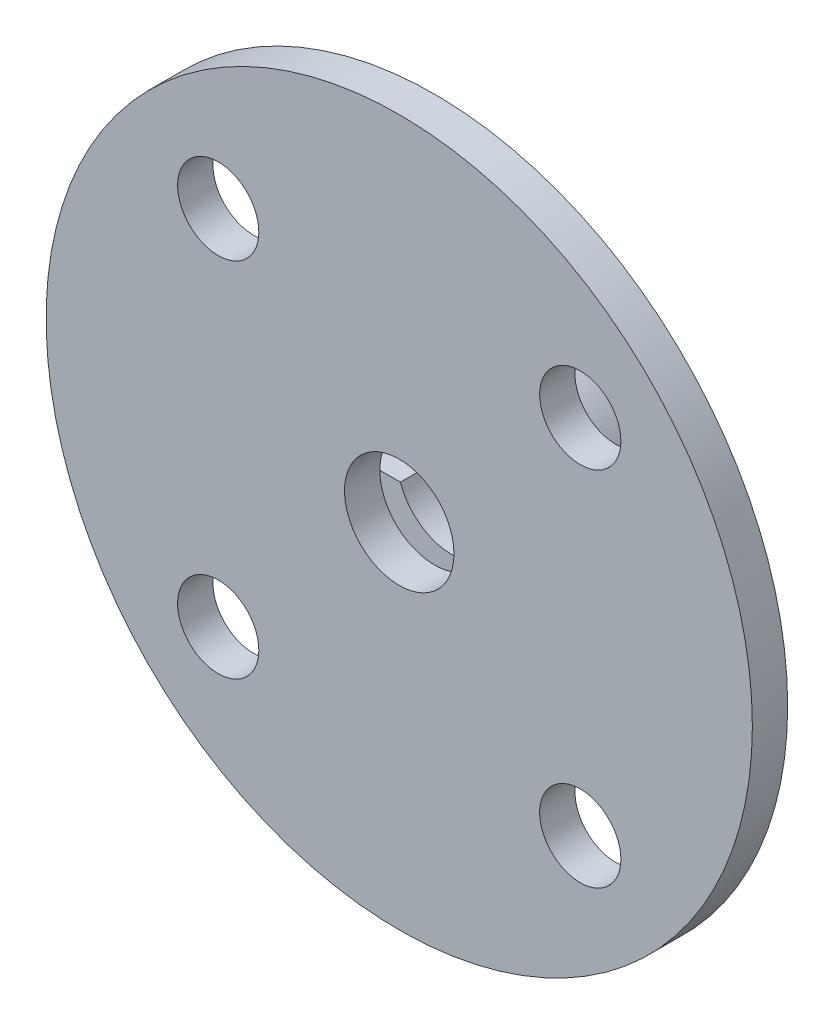
ISO-10303-21;
HEADER;
FILE_DESCRIPTION(('STEP AP214'),'2;1');
FILE_NAME('part.step','',(''),(''),'','','');
FILE_SCHEMA(('AUTOMOTIVE_DESIGN { 1 0 10303 214 1 1 1 1 }'));
ENDSEC;
DATA;
#1=APPLICATION_CONTEXT('core data for automotive mechanical design processes');
#2=APPLICATION_PROTOCOL_DEFINITION('international standard','automotive_design',2000,#1);
#3=PRODUCT_CONTEXT('',#1,'mechanical');
#4=PRODUCT('Part','Part','',(#3));
#5=PRODUCT_RELATED_PRODUCT_CATEGORY('part','',(#4));
#6=PRODUCT_DEFINITION_FORMATION('','',#4);
#7=PRODUCT_DEFINITION_CONTEXT('part definition',#1,'design');
#8=PRODUCT_DEFINITION('design','',#6,#7);
#9=PRODUCT_DEFINITION_SHAPE('','',#8);
#10=(LENGTH_UNIT() NAMED_UNIT(*) SI_UNIT(.MILLI.,.METRE.));
#11=(NAMED_UNIT(*) PLANE_ANGLE_UNIT() SI_UNIT($,.RADIAN.));
#12=(NAMED_UNIT(*) SI_UNIT($,.STERADIAN.) SOLID_ANGLE_UNIT());
#13=UNCERTAINTY_MEASURE_WITH_UNIT(LENGTH_MEASURE(1.E-05),#10,'distance_accuracy_value','');
#14=(GEOMETRIC_REPRESENTATION_CONTEXT(3) GLOBAL_UNCERTAINTY_ASSIGNED_CONTEXT((#13)) GLOBAL_UNIT_ASSIGNED_CONTEXT((#10,
#11,#12)) REPRESENTATION_CONTEXT('',''));
#15=CARTESIAN_POINT('',(0.,0.,0.));
#16=DIRECTION('',(0.,0.,1.));
#17=DIRECTION('',(1.,0.,0.));
#18=AXIS2_PLACEMENT_3D('',#15,#16,#17);
#19=CARTESIAN_POINT('',(0.,3.1,2.));
#20=DIRECTION('',(0.,-1.,0.));
#21=DIRECTION('',(0.,0.,-1.));
#22=AXIS2_PLACEMENT_3D('',#19,#20,#21);
#23=PLANE('',#22);
#24=DIRECTION('',(-1.,0.,0.));
#25=VECTOR('',#24,1.);
#26=CARTESIAN_POINT('',(0.,3.1,0.));
#27=LINE('',#26,#25);
#28=CARTESIAN_POINT('',(3.7,3.1,0.));
#29=VERTEX_POINT('',#28);
#30=CARTESIAN_POINT('',(0.,3.1,0.));
#31=VERTEX_POINT('',#30);
#32=EDGE_CURVE('E244',#29,#31,#27,.T.);
#33=ORIENTED_EDGE('',*,*,#32,.T.);
#34=CARTESIAN_POINT('',(-3.7,3.1,0.));
#35=VERTEX_POINT('',#34);
#36=EDGE_CURVE('E249',#31,#35,#27,.T.);
#37=ORIENTED_EDGE('',*,*,#36,.T.);
#38=DIRECTION('',(0.,0.,1.));
#39=VECTOR('',#38,1.);
#40=CARTESIAN_POINT('',(-3.7,3.1,-1.));
#41=LINE('',#40,#39);
#42=CARTESIAN_POINT('',(-3.7,3.1,-1.));
#43=VERTEX_POINT('',#42);
#44=EDGE_CURVE('E258',#43,#35,#41,.T.);
#45=ORIENTED_EDGE('',*,*,#44,.F.);
#46=DIRECTION('',(-1.,0.,0.));
#47=VECTOR('',#46,1.);
#48=CARTESIAN_POINT('',(0.,3.1,-1.));
#49=LINE('',#48,#47);
#50=CARTESIAN_POINT('',(0.,3.1,-1.));
#51=VERTEX_POINT('',#50);
#52=EDGE_CURVE('E231',#51,#43,#49,.T.);
#53=ORIENTED_EDGE('',*,*,#52,.F.);
#54=CARTESIAN_POINT('',(3.7,3.1,-1.));
#55=VERTEX_POINT('',#54);
#56=EDGE_CURVE('E234',#55,#51,#49,.T.);
#57=ORIENTED_EDGE('',*,*,#56,.F.);
#58=DIRECTION('',(0.,0.,1.));
#59=VECTOR('',#58,1.);
#60=CARTESIAN_POINT('',(3.7,3.1,-1.));
#61=LINE('',#60,#59);
#62=EDGE_CURVE('E239',#55,#29,#61,.T.);
#63=ORIENTED_EDGE('',*,*,#62,.T.);
#64=EDGE_LOOP('',(#33,#37,#45,#53,#57,#63));
#65=FACE_BOUND('',#64,.T.);
#66=ADVANCED_FACE('F45',(#65),#23,.T.);
#67=CARTESIAN_POINT('',(0.,0.,-6.));
#68=DIRECTION('',(0.,0.,-1.));
#69=DIRECTION('',(-1.,0.,0.));
#70=AXIS2_PLACEMENT_3D('',#67,#68,#69);
#71=PLANE('',#70);
#72=DIRECTION('',(-1.,0.,0.));
#73=VECTOR('',#72,1.);
#74=CARTESIAN_POINT('',(-5.44740133886171,-3.,-6.));
#75=LINE('',#74,#73);
#76=CARTESIAN_POINT('',(-6.32455532033676,-3.,-6.));
#77=VERTEX_POINT('',#76);
#78=CARTESIAN_POINT('',(-11.9474013388617,-3.,-6.));
#79=VERTEX_POINT('',#78);
#80=EDGE_CURVE('E422',#77,#79,#75,.T.);
#81=ORIENTED_EDGE('',*,*,#80,.T.);
#82=DIRECTION('',(0.,1.,0.));
#83=VECTOR('',#82,1.);
#84=CARTESIAN_POINT('',(-11.9474013388617,0.,-6.));
#85=LINE('',#84,#83);
#86=CARTESIAN_POINT('',(-11.9474013388617,-0.999999999999999,-6.));
#87=VERTEX_POINT('',#86);
#88=EDGE_CURVE('E54',#79,#87,#85,.T.);
#89=ORIENTED_EDGE('',*,*,#88,.T.);
#90=DIRECTION('',(1.,0.,0.));
#91=VECTOR('',#90,1.);
#92=CARTESIAN_POINT('',(-13.4474013388617,-0.999999999999999,-6.));
#93=LINE('',#92,#91);
#94=CARTESIAN_POINT('',(-2.93428015022424,-0.999999999999999,-6.));
#95=VERTEX_POINT('',#94);
#96=EDGE_CURVE('E441',#87,#95,#93,.T.);
#97=ORIENTED_EDGE('',*,*,#96,.T.);
#98=CARTESIAN_POINT('',(0.,0.,-6.));
#99=DIRECTION('',(0.,0.,-1.));
#100=DIRECTION('',(-1.,0.,0.));
#101=AXIS2_PLACEMENT_3D('',#98,#99,#100);
#102=CIRCLE('',#101,3.1);
#103=CARTESIAN_POINT('',(0.,3.1,-6.));
#104=VERTEX_POINT('',#103);
#105=EDGE_CURVE('E215',#104,#95,#102,.T.);
#106=ORIENTED_EDGE('',*,*,#105,.F.);
#107=DIRECTION('',(-1.,0.,0.));
#108=VECTOR('',#107,1.);
#109=CARTESIAN_POINT('',(2.5,3.1,-6.));
#110=LINE('',#109,#108);
#111=CARTESIAN_POINT('',(2.5,3.1,-6.));
#112=VERTEX_POINT('',#111);
#113=EDGE_CURVE('E460',#112,#104,#110,.T.);
#114=ORIENTED_EDGE('',*,*,#113,.F.);
#115=DIRECTION('',(0.,-1.,0.));
#116=VECTOR('',#115,1.);
#117=CARTESIAN_POINT('',(2.5,3.1,-6.));
#118=LINE('',#117,#116);
#119=CARTESIAN_POINT('',(2.5,6.53834841531101,-6.));
#120=VERTEX_POINT('',#119);
#121=EDGE_CURVE('E430',#120,#112,#118,.T.);
#122=ORIENTED_EDGE('',*,*,#121,.F.);
#123=CARTESIAN_POINT('',(0.,0.,-6.));
#124=DIRECTION('',(0.,0.,-1.));
#125=DIRECTION('',(-1.,0.,0.));
#126=AXIS2_PLACEMENT_3D('',#123,#124,#125);
#127=CIRCLE('',#126,7.);
#128=EDGE_CURVE('E248',#120,#77,#127,.T.);
#129=ORIENTED_EDGE('',*,*,#128,.T.);
#130=EDGE_LOOP('',(#81,#89,#97,#106,#114,#122,#129));
#131=FACE_BOUND('',#130,.T.);
#132=ADVANCED_FACE('F304',(#131),#71,.T.);
#133=CARTESIAN_POINT('',(0.,0.,-1.));
#134=DIRECTION('',(0.,0.,-1.));
#135=DIRECTION('',(-1.,0.,0.));
#136=AXIS2_PLACEMENT_3D('',#133,#134,#135);
#137=PLANE('',#136);
#138=DIRECTION('',(1.,0.,0.));
#139=VECTOR('',#138,1.);
#140=CARTESIAN_POINT('',(-13.4474013388617,-0.999999999999999,-1.));
#141=LINE('',#140,#139);
#142=CARTESIAN_POINT('',(-11.9474013388617,-0.999999999999999,-1.));
#143=VERTEX_POINT('',#142);
#144=CARTESIAN_POINT('',(-2.93428015022424,-0.999999999999999,-1.));
#145=VERTEX_POINT('',#144);
#146=EDGE_CURVE('E437',#143,#145,#141,.T.);
#147=ORIENTED_EDGE('',*,*,#146,.F.);
#148=DIRECTION('',(0.,1.,0.));
#149=VECTOR('',#148,1.);
#150=CARTESIAN_POINT('',(-11.9474013388617,-3.,-1.));
#151=LINE('',#150,#149);
#152=CARTESIAN_POINT('',(-11.9474013388617,-3.,-1.));
#153=VERTEX_POINT('',#152);
#154=EDGE_CURVE('E69',#143,#153,#151,.F.);
#155=ORIENTED_EDGE('',*,*,#154,.T.);
#156=DIRECTION('',(-1.,0.,0.));
#157=VECTOR('',#156,1.);
#158=CARTESIAN_POINT('',(-5.44740133886171,-3.,-1.));
#159=LINE('',#158,#157);
#160=CARTESIAN_POINT('',(-6.32455532033676,-3.,-1.));
#161=VERTEX_POINT('',#160);
#162=EDGE_CURVE('E444',#161,#153,#159,.T.);
#163=ORIENTED_EDGE('',*,*,#162,.F.);
#164=CARTESIAN_POINT('',(0.,0.,-1.));
#165=DIRECTION('',(0.,0.,-1.));
#166=DIRECTION('',(-1.,0.,0.));
#167=AXIS2_PLACEMENT_3D('',#164,#165,#166);
#168=CIRCLE('',#167,7.);
#169=CARTESIAN_POINT('',(3.7,5.94222180669823,-1.));
#170=VERTEX_POINT('',#169);
#171=EDGE_CURVE('E214',#170,#161,#168,.T.);
#172=ORIENTED_EDGE('',*,*,#171,.F.);
#173=DIRECTION('',(0.,-1.,0.));
#174=VECTOR('',#173,1.);
#175=CARTESIAN_POINT('',(3.7,3.1,-1.));
#176=LINE('',#175,#174);
#177=EDGE_CURVE('E233',#170,#55,#176,.T.);
#178=ORIENTED_EDGE('',*,*,#177,.T.);
#179=ORIENTED_EDGE('',*,*,#56,.T.);
#180=CARTESIAN_POINT('',(0.,0.,-1.));
#181=DIRECTION('',(0.,0.,-1.));
#182=DIRECTION('',(-1.,0.,0.));
#183=AXIS2_PLACEMENT_3D('',#180,#181,#182);
#184=CIRCLE('',#183,3.1);
#185=EDGE_CURVE('E479',#51,#145,#184,.T.);
#186=ORIENTED_EDGE('',*,*,#185,.T.);
#187=EDGE_LOOP('',(#147,#155,#163,#172,#178,#179,#186));
#188=FACE_BOUND('',#187,.T.);
#189=ADVANCED_FACE('F307',(#188),#137,.F.);
#190=CARTESIAN_POINT('',(0.,0.,0.));
#191=DIRECTION('',(0.,0.,1.));
#192=DIRECTION('',(1.,0.,0.));
#193=AXIS2_PLACEMENT_3D('',#190,#191,#192);
#194=PLANE('',#193);
#195=CARTESIAN_POINT('',(0.,0.,0.));
#196=DIRECTION('',(0.,0.,1.));
#197=DIRECTION('',(1.,0.,0.));
#198=AXIS2_PLACEMENT_3D('',#195,#196,#197);
#199=CIRCLE('',#198,7.);
#200=CARTESIAN_POINT('',(3.7,5.94222180669823,0.));
#201=VERTEX_POINT('',#200);
#202=CARTESIAN_POINT('',(-3.7,5.94222180669823,0.));
#203=VERTEX_POINT('',#202);
#204=EDGE_CURVE('E332',#201,#203,#199,.T.);
#205=ORIENTED_EDGE('',*,*,#204,.T.);
#206=DIRECTION('',(0.,1.,0.));
#207=VECTOR('',#206,1.);
#208=CARTESIAN_POINT('',(-3.7,3.1,0.));
#209=LINE('',#208,#207);
#210=EDGE_CURVE('E224',#35,#203,#209,.T.);
#211=ORIENTED_EDGE('',*,*,#210,.F.);
#212=ORIENTED_EDGE('',*,*,#36,.F.);
#213=CARTESIAN_POINT('',(0.,0.,0.));
#214=DIRECTION('',(0.,0.,1.));
#215=DIRECTION('',(1.,0.,0.));
#216=AXIS2_PLACEMENT_3D('',#213,#214,#215);
#217=CIRCLE('',#216,3.1);
#218=EDGE_CURVE('E362',#31,#31,#217,.T.);
#219=ORIENTED_EDGE('',*,*,#218,.T.);
#220=ORIENTED_EDGE('',*,*,#32,.F.);
#221=DIRECTION('',(0.,-1.,0.));
#222=VECTOR('',#221,1.);
#223=CARTESIAN_POINT('',(3.7,3.1,0.));
#224=LINE('',#223,#222);
#225=EDGE_CURVE('E252',#201,#29,#224,.T.);
#226=ORIENTED_EDGE('',*,*,#225,.F.);
#227=EDGE_LOOP('',(#205,#211,#212,#219,#220,#226));
#228=FACE_BOUND('',#227,.T.);
#229=CARTESIAN_POINT('',(10.2530483272049,-10.2530483272049,0.));
#230=DIRECTION('',(0.,0.,1.));
#231=DIRECTION('',(1.,0.,0.));
#232=AXIS2_PLACEMENT_3D('',#229,#230,#231);
#233=CIRCLE('',#232,2.3);
#234=CARTESIAN_POINT('',(12.5530483272049,-10.2530483272049,0.));
#235=VERTEX_POINT('',#234);
#236=EDGE_CURVE('E226',#235,#235,#233,.T.);
#237=ORIENTED_EDGE('',*,*,#236,.T.);
#238=EDGE_LOOP('',(#237));
#239=FACE_BOUND('',#238,.T.);
#240=CARTESIAN_POINT('',(-10.2530483272049,-10.2530483272049,0.));
#241=DIRECTION('',(0.,0.,1.));
#242=DIRECTION('',(1.,0.,0.));
#243=AXIS2_PLACEMENT_3D('',#240,#241,#242);
#244=CIRCLE('',#243,2.3);
#245=CARTESIAN_POINT('',(-7.95304832720494,-10.2530483272049,0.));
#246=VERTEX_POINT('',#245);
#247=EDGE_CURVE('E339',#246,#246,#244,.T.);
#248=ORIENTED_EDGE('',*,*,#247,.T.);
#249=EDGE_LOOP('',(#248));
#250=FACE_BOUND('',#249,.T.);
#251=CARTESIAN_POINT('',(-10.2530483272049,10.2530483272049,0.));
#252=DIRECTION('',(0.,0.,1.));
#253=DIRECTION('',(1.,0.,0.));
#254=AXIS2_PLACEMENT_3D('',#251,#252,#253);
#255=CIRCLE('',#254,2.3);
#256=CARTESIAN_POINT('',(-7.95304832720494,10.2530483272049,0.));
#257=VERTEX_POINT('',#256);
#258=EDGE_CURVE('E343',#257,#257,#255,.T.);
#259=ORIENTED_EDGE('',*,*,#258,.T.);
#260=EDGE_LOOP('',(#259));
#261=FACE_BOUND('',#260,.T.);
#262=CARTESIAN_POINT('',(10.2530483272049,10.2530483272049,0.));
#263=DIRECTION('',(0.,0.,1.));
#264=DIRECTION('',(1.,0.,0.));
#265=AXIS2_PLACEMENT_3D('',#262,#263,#264);
#266=CIRCLE('',#265,2.3);
#267=CARTESIAN_POINT('',(12.5530483272049,10.2530483272049,0.));
#268=VERTEX_POINT('',#267);
#269=EDGE_CURVE('E347',#268,#268,#266,.T.);
#270=ORIENTED_EDGE('',*,*,#269,.T.);
#271=EDGE_LOOP('',(#270));
#272=FACE_BOUND('',#271,.T.);
#273=CARTESIAN_POINT('',(0.,0.,0.));
#274=DIRECTION('',(0.,0.,1.));
#275=DIRECTION('',(1.,0.,0.));
#276=AXIS2_PLACEMENT_3D('',#273,#274,#275);
#277=CIRCLE('',#276,20.);
#278=CARTESIAN_POINT('',(20.,0.,0.));
#279=VERTEX_POINT('',#278);
#280=EDGE_CURVE('E350',#279,#279,#277,.T.);
#281=ORIENTED_EDGE('',*,*,#280,.F.);
#282=EDGE_LOOP('',(#281));
#283=FACE_BOUND('',#282,.T.);
#284=ADVANCED_FACE('F315',(#228,#239,#250,#261,#272,#283),#194,.F.);
#285=CARTESIAN_POINT('',(-3.7,3.1,-1.));
#286=DIRECTION('',(1.,0.,0.));
#287=DIRECTION('',(0.,0.,-1.));
#288=AXIS2_PLACEMENT_3D('',#285,#286,#287);
#289=PLANE('',#288);
#290=ORIENTED_EDGE('',*,*,#210,.T.);
#291=DIRECTION('',(0.,0.,-1.));
#292=VECTOR('',#291,1.);
#293=CARTESIAN_POINT('',(-3.7,5.94222180669823,0.));
#294=LINE('',#293,#292);
#295=CARTESIAN_POINT('',(-3.7,5.94222180669823,-1.));
#296=VERTEX_POINT('',#295);
#297=EDGE_CURVE('E205',#203,#296,#294,.T.);
#298=ORIENTED_EDGE('',*,*,#297,.T.);
#299=DIRECTION('',(0.,1.,0.));
#300=VECTOR('',#299,1.);
#301=CARTESIAN_POINT('',(-3.7,3.1,-1.));
#302=LINE('',#301,#300);
#303=EDGE_CURVE('E222',#43,#296,#302,.T.);
#304=ORIENTED_EDGE('',*,*,#303,.F.);
#305=ORIENTED_EDGE('',*,*,#44,.T.);
#306=EDGE_LOOP('',(#290,#298,#304,#305));
#307=FACE_BOUND('',#306,.T.);
#308=ADVANCED_FACE('F220',(#307),#289,.F.);
#309=CARTESIAN_POINT('',(3.7,3.1,-1.));
#310=DIRECTION('',(-1.,0.,0.));
#311=DIRECTION('',(0.,0.,1.));
#312=AXIS2_PLACEMENT_3D('',#309,#310,#311);
#313=PLANE('',#312);
#314=ORIENTED_EDGE('',*,*,#177,.F.);
#315=DIRECTION('',(0.,0.,-1.));
#316=VECTOR('',#315,1.);
#317=CARTESIAN_POINT('',(3.7,5.94222180669823,0.));
#318=LINE('',#317,#316);
#319=EDGE_CURVE('E227',#170,#201,#318,.F.);
#320=ORIENTED_EDGE('',*,*,#319,.T.);
#321=ORIENTED_EDGE('',*,*,#225,.T.);
#322=ORIENTED_EDGE('',*,*,#62,.F.);
#323=EDGE_LOOP('',(#314,#320,#321,#322));
#324=FACE_BOUND('',#323,.T.);
#325=ADVANCED_FACE('F302',(#324),#313,.F.);
#326=DIRECTION('',(-1.,0.,0.));
#327=VECTOR('',#326,1.);
#328=CARTESIAN_POINT('',(-5.44740133886171,1.,-6.));
#329=LINE('',#328,#327);
#330=CARTESIAN_POINT('',(-2.93428015022424,1.,-6.));
#331=VERTEX_POINT('',#330);
#332=CARTESIAN_POINT('',(-11.9474013388617,1.,-6.));
#333=VERTEX_POINT('',#332);
#334=EDGE_CURVE('E414',#331,#333,#329,.T.);
#335=ORIENTED_EDGE('',*,*,#334,.T.);
#336=DIRECTION('',(0.,1.,0.));
#337=VECTOR('',#336,1.);
#338=CARTESIAN_POINT('',(-11.9474013388617,0.,-6.));
#339=LINE('',#338,#337);
#340=CARTESIAN_POINT('',(-11.9474013388617,3.,-6.));
#341=VERTEX_POINT('',#340);
#342=EDGE_CURVE('E11',#333,#341,#339,.T.);
#343=ORIENTED_EDGE('',*,*,#342,.T.);
#344=DIRECTION('',(1.,0.,0.));
#345=VECTOR('',#344,1.);
#346=CARTESIAN_POINT('',(-13.4474013388617,3.,-6.));
#347=LINE('',#346,#345);
#348=CARTESIAN_POINT('',(-6.32455532033676,3.,-6.));
#349=VERTEX_POINT('',#348);
#350=EDGE_CURVE('E419',#341,#349,#347,.T.);
#351=ORIENTED_EDGE('',*,*,#350,.T.);
#352=CARTESIAN_POINT('',(-2.5,6.53834841531101,-6.));
#353=VERTEX_POINT('',#352);
#354=EDGE_CURVE('E485',#349,#353,#127,.T.);
#355=ORIENTED_EDGE('',*,*,#354,.T.);
#356=DIRECTION('',(0.,1.,0.));
#357=VECTOR('',#356,1.);
#358=CARTESIAN_POINT('',(-2.5,6.53834841531101,-6.));
#359=LINE('',#358,#357);
#360=CARTESIAN_POINT('',(-2.5,3.1,-6.));
#361=VERTEX_POINT('',#360);
#362=EDGE_CURVE('E456',#361,#353,#359,.T.);
#363=ORIENTED_EDGE('',*,*,#362,.F.);
#364=EDGE_CURVE('E265',#104,#361,#110,.T.);
#365=ORIENTED_EDGE('',*,*,#364,.F.);
#366=EDGE_CURVE('E478',#331,#104,#102,.T.);
#367=ORIENTED_EDGE('',*,*,#366,.F.);
#368=EDGE_LOOP('',(#335,#343,#351,#355,#363,#365,#367));
#369=FACE_BOUND('',#368,.T.);
#370=ADVANCED_FACE('F299',(#369),#71,.T.);
#371=DIRECTION('',(1.,0.,0.));
#372=VECTOR('',#371,1.);
#373=CARTESIAN_POINT('',(-13.4474013388617,3.,-1.));
#374=LINE('',#373,#372);
#375=CARTESIAN_POINT('',(-11.9474013388617,3.,-1.));
#376=VERTEX_POINT('',#375);
#377=CARTESIAN_POINT('',(-6.32455532033676,3.,-1.));
#378=VERTEX_POINT('',#377);
#379=EDGE_CURVE('E410',#376,#378,#374,.T.);
#380=ORIENTED_EDGE('',*,*,#379,.F.);
#381=DIRECTION('',(0.,1.,0.));
#382=VECTOR('',#381,1.);
#383=CARTESIAN_POINT('',(-11.9474013388617,1.,-1.));
#384=LINE('',#383,#382);
#385=CARTESIAN_POINT('',(-11.9474013388617,1.,-1.));
#386=VERTEX_POINT('',#385);
#387=EDGE_CURVE('E667',#376,#386,#384,.F.);
#388=ORIENTED_EDGE('',*,*,#387,.T.);
#389=DIRECTION('',(-1.,0.,0.));
#390=VECTOR('',#389,1.);
#391=CARTESIAN_POINT('',(-5.44740133886171,1.,-1.));
#392=LINE('',#391,#390);
#393=CARTESIAN_POINT('',(-2.93428015022424,1.,-1.));
#394=VERTEX_POINT('',#393);
#395=EDGE_CURVE('E413',#394,#386,#392,.T.);
#396=ORIENTED_EDGE('',*,*,#395,.F.);
#397=EDGE_CURVE('E474',#394,#51,#184,.T.);
#398=ORIENTED_EDGE('',*,*,#397,.T.);
#399=ORIENTED_EDGE('',*,*,#52,.T.);
#400=ORIENTED_EDGE('',*,*,#303,.T.);
#401=EDGE_CURVE('E201',#378,#296,#168,.T.);
#402=ORIENTED_EDGE('',*,*,#401,.F.);
#403=EDGE_LOOP('',(#380,#388,#396,#398,#399,#400,#402));
#404=FACE_BOUND('',#403,.T.);
#405=ADVANCED_FACE('F229',(#404),#137,.F.);
#406=CARTESIAN_POINT('',(0.,0.,-6.));
#407=DIRECTION('',(0.,0.,1.));
#408=DIRECTION('',(1.,0.,0.));
#409=AXIS2_PLACEMENT_3D('',#406,#407,#408);
#410=CYLINDRICAL_SURFACE('',#409,7.);
#411=ORIENTED_EDGE('',*,*,#128,.F.);
#412=CARTESIAN_POINT('',(0.,0.,-6.));
#413=DIRECTION('',(0.,0.,1.));
#414=DIRECTION('',(1.,0.,0.));
#415=AXIS2_PLACEMENT_3D('',#412,#413,#414);
#416=CIRCLE('',#415,7.);
#417=EDGE_CURVE('E281',#120,#353,#416,.T.);
#418=ORIENTED_EDGE('',*,*,#417,.T.);
#419=ORIENTED_EDGE('',*,*,#354,.F.);
#420=DIRECTION('',(0.,0.,1.));
#421=VECTOR('',#420,1.);
#422=CARTESIAN_POINT('',(-6.32455532033676,3.,-6.));
#423=LINE('',#422,#421);
#424=EDGE_CURVE('E209',#349,#378,#423,.T.);
#425=ORIENTED_EDGE('',*,*,#424,.T.);
#426=ORIENTED_EDGE('',*,*,#401,.T.);
#427=ORIENTED_EDGE('',*,*,#297,.F.);
#428=ORIENTED_EDGE('',*,*,#204,.F.);
#429=ORIENTED_EDGE('',*,*,#319,.F.);
#430=ORIENTED_EDGE('',*,*,#171,.T.);
#431=DIRECTION('',(0.,0.,1.));
#432=VECTOR('',#431,1.);
#433=CARTESIAN_POINT('',(-6.32455532033676,-3.,-6.));
#434=LINE('',#433,#432);
#435=EDGE_CURVE('E261',#161,#77,#434,.F.);
#436=ORIENTED_EDGE('',*,*,#435,.T.);
#437=EDGE_LOOP('',(#411,#418,#419,#425,#426,#427,#428,#429,#430,#436));
#438=FACE_BOUND('',#437,.T.);
#439=ADVANCED_FACE('F204',(#438),#410,.T.);
#440=CARTESIAN_POINT('',(0.,0.,-6.));
#441=DIRECTION('',(0.,0.,1.));
#442=DIRECTION('',(1.,0.,0.));
#443=AXIS2_PLACEMENT_3D('',#440,#441,#442);
#444=CYLINDRICAL_SURFACE('',#443,3.1);
#445=DIRECTION('',(0.,0.,1.));
#446=VECTOR('',#445,1.);
#447=CARTESIAN_POINT('',(-2.93428015022424,-0.999999999999999,-6.));
#448=LINE('',#447,#446);
#449=EDGE_CURVE('E353',#145,#95,#448,.F.);
#450=ORIENTED_EDGE('',*,*,#449,.F.);
#451=ORIENTED_EDGE('',*,*,#185,.F.);
#452=ORIENTED_EDGE('',*,*,#397,.F.);
#453=DIRECTION('',(0.,0.,1.));
#454=VECTOR('',#453,1.);
#455=CARTESIAN_POINT('',(-2.93428015022424,1.,-6.));
#456=LINE('',#455,#454);
#457=EDGE_CURVE('E359',#331,#394,#456,.T.);
#458=ORIENTED_EDGE('',*,*,#457,.F.);
#459=ORIENTED_EDGE('',*,*,#366,.T.);
#460=ORIENTED_EDGE('',*,*,#105,.T.);
#461=EDGE_LOOP('',(#450,#451,#452,#458,#459,#460));
#462=FACE_BOUND('',#461,.T.);
#463=ADVANCED_FACE('F293',(#462),#444,.F.);
#464=CARTESIAN_POINT('',(2.5,3.1,-7.));
#465=DIRECTION('',(-1.,0.,0.));
#466=DIRECTION('',(0.,0.,1.));
#467=AXIS2_PLACEMENT_3D('',#464,#465,#466);
#468=PLANE('',#467);
#469=DIRECTION('',(0.,-1.,0.));
#470=VECTOR('',#469,1.);
#471=CARTESIAN_POINT('',(2.5,6.53834841531101,-9.));
#472=LINE('',#471,#470);
#473=CARTESIAN_POINT('',(2.5,3.1224989991992,-9.));
#474=VERTEX_POINT('',#473);
#475=CARTESIAN_POINT('',(2.5,3.1,-9.));
#476=VERTEX_POINT('',#475);
#477=EDGE_CURVE('E372',#474,#476,#472,.T.);
#478=ORIENTED_EDGE('',*,*,#477,.F.);
#479=CARTESIAN_POINT('',(2.5,3.1224989991992,-9.));
#480=CARTESIAN_POINT('',(2.5,3.2409540681944,-9.00003922582886));
#481=CARTESIAN_POINT('',(2.5,3.35948882128608,-8.99572293763021));
#482=CARTESIAN_POINT('',(2.5,3.59604026179857,-8.97750430192387));
#483=CARTESIAN_POINT('',(2.5,3.71405548134156,-8.9635832105116));
#484=CARTESIAN_POINT('',(2.5,3.94894057160824,-8.92518787418692));
#485=CARTESIAN_POINT('',(2.5,4.0658030185919,-8.90066699120315));
#486=CARTESIAN_POINT('',(2.5,4.29652541907285,-8.84054419596716));
#487=CARTESIAN_POINT('',(2.5,4.41038787733796,-8.80495186749294));
#488=CARTESIAN_POINT('',(2.5,4.69241493001419,-8.70068672947607));
#489=CARTESIAN_POINT('',(2.5,4.85787592375537,-8.62444574420645));
#490=CARTESIAN_POINT('',(2.5,5.17345575289964,-8.44569682568641));
#491=CARTESIAN_POINT('',(2.5,5.3236121838059,-8.34325553992864));
#492=CARTESIAN_POINT('',(2.5,5.60446278892443,-8.11307177362191));
#493=CARTESIAN_POINT('',(2.5,5.7350578748275,-7.98520763988841));
#494=CARTESIAN_POINT('',(2.5,5.97079646022068,-7.70758442943991));
#495=CARTESIAN_POINT('',(2.5,6.07592282218428,-7.55781071818364));
#496=CARTESIAN_POINT('',(2.5,6.24911265794058,-7.25352599452841));
#497=CARTESIAN_POINT('',(2.5,6.31942235264461,-7.1002888026274));
#498=CARTESIAN_POINT('',(2.5,6.43178371073443,-6.78392034770438));
#499=CARTESIAN_POINT('',(2.5,6.47388192144866,-6.6208058690205));
#500=CARTESIAN_POINT('',(2.5,6.51350668439015,-6.38012572115975));
#501=CARTESIAN_POINT('',(2.5,6.52282118500427,-6.30434123172476));
#502=CARTESIAN_POINT('',(2.5,6.53523636624017,-6.15238425001772));
#503=CARTESIAN_POINT('',(2.5,6.53834673956563,-6.07621254966249));
#504=CARTESIAN_POINT('',(2.5,6.53834841531101,-6.));
#505=B_SPLINE_CURVE_WITH_KNOTS('',3,(#479,#480,#481,#482,#483,#484,#485,#486,#487,#488,#489,
#490,#491,#492,#493,#494,#495,#496,#497,#498,#499,#500,#501,#502,#503,#504),.UNSPECIFIED.,.F.,
.F.,(4,2,2,2,2,2,2,2,2,2,2,2,4),(0.,0.355401775685248,0.711499091855741,1.06917940937092,
1.4265509655736,1.97060110455871,2.51328083688975,3.05862275865678,3.60433062002109,
4.10760767241748,4.61005228855104,4.83890334323823,5.06739658316855),.UNSPECIFIED.);
#506=EDGE_CURVE('E272',#474,#120,#505,.T.);
#507=ORIENTED_EDGE('',*,*,#506,.T.);
#508=ORIENTED_EDGE('',*,*,#121,.T.);
#509=DIRECTION('',(0.,0.,1.));
#510=VECTOR('',#509,1.);
#511=CARTESIAN_POINT('',(2.5,3.1,-7.));
#512=LINE('',#511,#510);
#513=CARTESIAN_POINT('',(2.5,3.1,-7.));
#514=VERTEX_POINT('',#513);
#515=EDGE_CURVE('E470',#514,#112,#512,.T.);
#516=ORIENTED_EDGE('',*,*,#515,.F.);
#517=DIRECTION('',(0.,0.,1.));
#518=VECTOR('',#517,1.);
#519=CARTESIAN_POINT('',(2.5,3.1,-9.));
#520=LINE('',#519,#518);
#521=EDGE_CURVE('E389',#476,#514,#520,.T.);
#522=ORIENTED_EDGE('',*,*,#521,.F.);
#523=EDGE_LOOP('',(#478,#507,#508,#516,#522));
#524=FACE_BOUND('',#523,.T.);
#525=ADVANCED_FACE('F287',(#524),#468,.F.);
#526=CARTESIAN_POINT('',(2.5,3.1,-7.));
#527=DIRECTION('',(0.,1.,0.));
#528=DIRECTION('',(0.,0.,1.));
#529=AXIS2_PLACEMENT_3D('',#526,#527,#528);
#530=PLANE('',#529);
#531=ORIENTED_EDGE('',*,*,#113,.T.);
#532=ORIENTED_EDGE('',*,*,#364,.T.);
#533=DIRECTION('',(0.,0.,1.));
#534=VECTOR('',#533,1.);
#535=CARTESIAN_POINT('',(-2.5,3.1,-7.));
#536=LINE('',#535,#534);
#537=CARTESIAN_POINT('',(-2.5,3.1,-7.));
#538=VERTEX_POINT('',#537);
#539=EDGE_CURVE('E455',#538,#361,#536,.T.);
#540=ORIENTED_EDGE('',*,*,#539,.F.);
#541=DIRECTION('',(-1.,0.,0.));
#542=VECTOR('',#541,1.);
#543=CARTESIAN_POINT('',(2.5,3.1,-7.));
#544=LINE('',#543,#542);
#545=EDGE_CURVE('E451',#514,#538,#544,.T.);
#546=ORIENTED_EDGE('',*,*,#545,.F.);
#547=ORIENTED_EDGE('',*,*,#515,.T.);
#548=EDGE_LOOP('',(#531,#532,#540,#546,#547));
#549=FACE_BOUND('',#548,.T.);
#550=ADVANCED_FACE('F292',(#549),#530,.F.);
#551=CARTESIAN_POINT('',(-2.5,6.53834841531101,-7.));
#552=DIRECTION('',(1.,0.,0.));
#553=DIRECTION('',(0.,0.,-1.));
#554=AXIS2_PLACEMENT_3D('',#551,#552,#553);
#555=PLANE('',#554);
#556=ORIENTED_EDGE('',*,*,#362,.T.);
#557=CARTESIAN_POINT('',(-2.5,6.53834841531101,-6.));
#558=CARTESIAN_POINT('',(-2.5,6.53835826173047,-6.07979357312476));
#559=CARTESIAN_POINT('',(-2.5,6.53494026605924,-6.15958246868836));
#560=CARTESIAN_POINT('',(-2.5,6.52132433582911,-6.31856983147222));
#561=CARTESIAN_POINT('',(-2.5,6.51112726043429,-6.39776837222656));
#562=CARTESIAN_POINT('',(-2.5,6.48405699057202,-6.55485134657615));
#563=CARTESIAN_POINT('',(-2.5,6.46719769073333,-6.63273816561845));
#564=CARTESIAN_POINT('',(-2.5,6.4269680393545,-6.78678933181518));
#565=CARTESIAN_POINT('',(-2.5,6.40359767680145,-6.86295367605596));
#566=CARTESIAN_POINT('',(-2.5,6.32398452778141,-7.08807417929552));
#567=CARTESIAN_POINT('',(-2.5,6.25821744945778,-7.23378545367983));
#568=CARTESIAN_POINT('',(-2.5,6.1035877904596,-7.51229794899763));
#569=CARTESIAN_POINT('',(-2.5,6.01471915182143,-7.64509577104334));
#570=CARTESIAN_POINT('',(-2.5,5.814970628856,-7.89690492146199));
#571=CARTESIAN_POINT('',(-2.5,5.70372122432347,-8.01562297992118));
#572=CARTESIAN_POINT('',(-2.5,5.46387637196474,-8.23382968622174));
#573=CARTESIAN_POINT('',(-2.5,5.33528572525427,-8.33332363798815));
#574=CARTESIAN_POINT('',(-2.5,5.05685384127684,-8.51663824345711));
#575=CARTESIAN_POINT('',(-2.5,4.90622174087631,-8.59925294273705));
#576=CARTESIAN_POINT('',(-2.5,4.59392982795614,-8.74083607210584));
#577=CARTESIAN_POINT('',(-2.5,4.43224931328764,-8.79975860360918));
#578=CARTESIAN_POINT('',(-2.5,4.1743215773854,-8.87370078510161));
#579=CARTESIAN_POINT('',(-2.5,4.08024996346199,-8.89666414542046));
#580=CARTESIAN_POINT('',(-2.5,3.8906019348994,-8.93548300467786));
#581=CARTESIAN_POINT('',(-2.5,3.79502495643573,-8.95133577154549));
#582=CARTESIAN_POINT('',(-2.5,3.60342730999772,-8.97621960297479));
#583=CARTESIAN_POINT('',(-2.5,3.5074103237594,-8.98527974286542));
#584=CARTESIAN_POINT('',(-2.5,3.31508351581558,-8.99717517706927));
#585=CARTESIAN_POINT('',(-2.5,3.21877408872048,-9.00001676070059));
#586=CARTESIAN_POINT('',(-2.5,3.1224989991992,-9.));
#587=B_SPLINE_CURVE_WITH_KNOTS('',3,(#557,#558,#559,#560,#561,#562,#563,#564,#565,#566,#567,
#568,#569,#570,#571,#572,#573,#574,#575,#576,#577,#578,#579,#580,#581,#582,#583,#584,#585,#586),
.UNSPECIFIED.,.F.,.F.,(4,2,2,2,2,2,2,2,2,2,2,2,2,2,4),(0.,0.239299376755625,0.478568431070175,
0.717341081270607,0.956114135337424,1.4332764574731,1.9105640331874,2.39649637850715,
2.88229446320419,3.39559071972088,3.90987664321567,4.20014030638634,4.49051540090607,
4.77964035679274,5.06847276232731),.UNSPECIFIED.);
#588=CARTESIAN_POINT('',(-2.5,3.1224989991992,-9.));
#589=VERTEX_POINT('',#588);
#590=EDGE_CURVE('E537',#353,#589,#587,.T.);
#591=ORIENTED_EDGE('',*,*,#590,.T.);
#592=DIRECTION('',(0.,1.,0.));
#593=VECTOR('',#592,1.);
#594=CARTESIAN_POINT('',(-2.5,6.53834841531101,-9.));
#595=LINE('',#594,#593);
#596=CARTESIAN_POINT('',(-2.5,3.1,-9.));
#597=VERTEX_POINT('',#596);
#598=EDGE_CURVE('E378',#597,#589,#595,.T.);
#599=ORIENTED_EDGE('',*,*,#598,.F.);
#600=DIRECTION('',(0.,0.,1.));
#601=VECTOR('',#600,1.);
#602=CARTESIAN_POINT('',(-2.5,3.1,-9.));
#603=LINE('',#602,#601);
#604=EDGE_CURVE('E382',#597,#538,#603,.T.);
#605=ORIENTED_EDGE('',*,*,#604,.T.);
#606=ORIENTED_EDGE('',*,*,#539,.T.);
#607=EDGE_LOOP('',(#556,#591,#599,#605,#606));
#608=FACE_BOUND('',#607,.T.);
#609=ADVANCED_FACE('F551',(#608),#555,.F.);
#610=CARTESIAN_POINT('',(-13.4474013388617,-0.999999999999999,-1.));
#611=DIRECTION('',(0.,1.,0.));
#612=DIRECTION('',(-1.,0.,0.));
#613=AXIS2_PLACEMENT_3D('',#610,#611,#612);
#614=PLANE('',#613);
#615=CARTESIAN_POINT('',(-10.8,-0.999999999999999,-4.));
#616=DIRECTION('',(0.,1.,0.));
#617=DIRECTION('',(-1.,0.,0.));
#618=AXIS2_PLACEMENT_3D('',#615,#616,#617);
#619=CIRCLE('',#618,1.6);
#620=CARTESIAN_POINT('',(-12.4,-0.999999999999999,-4.));
#621=VERTEX_POINT('',#620);
#622=EDGE_CURVE('E405',#621,#621,#619,.T.);
#623=ORIENTED_EDGE('',*,*,#622,.F.);
#624=EDGE_LOOP('',(#623));
#625=FACE_BOUND('',#624,.T.);
#626=DIRECTION('',(0.,0.,-1.));
#627=VECTOR('',#626,1.);
#628=CARTESIAN_POINT('',(-13.4474013388617,-0.999999999999999,-1.));
#629=LINE('',#628,#627);
#630=CARTESIAN_POINT('',(-13.4474013388617,-0.999999999999999,-2.5));
#631=VERTEX_POINT('',#630);
#632=CARTESIAN_POINT('',(-13.4474013388617,-0.999999999999999,-4.5));
#633=VERTEX_POINT('',#632);
#634=EDGE_CURVE('E409',#631,#633,#629,.T.);
#635=ORIENTED_EDGE('',*,*,#634,.F.);
#636=CARTESIAN_POINT('',(-11.9474013388617,-0.999999999999999,-2.5));
#637=DIRECTION('',(0.,1.,0.));
#638=DIRECTION('',(-1.,0.,0.));
#639=AXIS2_PLACEMENT_3D('',#636,#637,#638);
#640=CIRCLE('',#639,1.5);
#641=EDGE_CURVE('E503',#631,#143,#640,.T.);
#642=ORIENTED_EDGE('',*,*,#641,.T.);
#643=ORIENTED_EDGE('',*,*,#146,.T.);
#644=ORIENTED_EDGE('',*,*,#449,.T.);
#645=ORIENTED_EDGE('',*,*,#96,.F.);
#646=CARTESIAN_POINT('',(-11.9474013388617,-0.999999999999999,-4.5));
#647=DIRECTION('',(0.,1.,0.));
#648=DIRECTION('',(-1.,0.,0.));
#649=AXIS2_PLACEMENT_3D('',#646,#647,#648);
#650=CIRCLE('',#649,1.5);
#651=EDGE_CURVE('E511',#87,#633,#650,.T.);
#652=ORIENTED_EDGE('',*,*,#651,.T.);
#653=EDGE_LOOP('',(#635,#642,#643,#644,#645,#652));
#654=FACE_BOUND('',#653,.T.);
#655=ADVANCED_FACE('F523',(#625,#654),#614,.T.);
#656=CARTESIAN_POINT('',(-5.44740133886171,-3.,-1.));
#657=DIRECTION('',(0.,-1.,0.));
#658=DIRECTION('',(0.,0.,-1.));
#659=AXIS2_PLACEMENT_3D('',#656,#657,#658);
#660=PLANE('',#659);
#661=CARTESIAN_POINT('',(-10.8,-3.,-4.));
#662=DIRECTION('',(0.,-1.,0.));
#663=DIRECTION('',(0.,0.,-1.));
#664=AXIS2_PLACEMENT_3D('',#661,#662,#663);
#665=CIRCLE('',#664,1.6);
#666=CARTESIAN_POINT('',(-10.8,-3.,-5.6));
#667=VERTEX_POINT('',#666);
#668=EDGE_CURVE('E401',#667,#667,#665,.T.);
#669=ORIENTED_EDGE('',*,*,#668,.F.);
#670=EDGE_LOOP('',(#669));
#671=FACE_BOUND('',#670,.T.);
#672=ORIENTED_EDGE('',*,*,#162,.T.);
#673=CARTESIAN_POINT('',(-11.9474013388617,-3.,-2.5));
#674=DIRECTION('',(0.,-1.,0.));
#675=DIRECTION('',(0.,0.,-1.));
#676=AXIS2_PLACEMENT_3D('',#673,#674,#675);
#677=CIRCLE('',#676,1.5);
#678=CARTESIAN_POINT('',(-13.4474013388617,-3.,-2.5));
#679=VERTEX_POINT('',#678);
#680=EDGE_CURVE('E505',#153,#679,#677,.T.);
#681=ORIENTED_EDGE('',*,*,#680,.T.);
#682=DIRECTION('',(0.,0.,-1.));
#683=VECTOR('',#682,1.);
#684=CARTESIAN_POINT('',(-13.4474013388617,-3.,-1.));
#685=LINE('',#684,#683);
#686=CARTESIAN_POINT('',(-13.4474013388617,-3.,-4.5));
#687=VERTEX_POINT('',#686);
#688=EDGE_CURVE('E434',#679,#687,#685,.T.);
#689=ORIENTED_EDGE('',*,*,#688,.T.);
#690=CARTESIAN_POINT('',(-11.9474013388617,-3.,-4.5));
#691=DIRECTION('',(0.,-1.,0.));
#692=DIRECTION('',(0.,0.,-1.));
#693=AXIS2_PLACEMENT_3D('',#690,#691,#692);
#694=CIRCLE('',#693,1.5);
#695=EDGE_CURVE('E61',#687,#79,#694,.T.);
#696=ORIENTED_EDGE('',*,*,#695,.T.);
#697=ORIENTED_EDGE('',*,*,#80,.F.);
#698=ORIENTED_EDGE('',*,*,#435,.F.);
#699=EDGE_LOOP('',(#672,#681,#689,#696,#697,#698));
#700=FACE_BOUND('',#699,.T.);
#701=ADVANCED_FACE('F495',(#671,#700),#660,.T.);
#702=CARTESIAN_POINT('',(-13.4474013388617,-3.,-1.));
#703=DIRECTION('',(-1.,0.,0.));
#704=DIRECTION('',(0.,0.,1.));
#705=AXIS2_PLACEMENT_3D('',#702,#703,#704);
#706=PLANE('',#705);
#707=ORIENTED_EDGE('',*,*,#688,.F.);
#708=DIRECTION('',(0.,1.,0.));
#709=VECTOR('',#708,1.);
#710=CARTESIAN_POINT('',(-13.4474013388617,-0.999999999999999,-2.5));
#711=LINE('',#710,#709);
#712=EDGE_CURVE('E697',#679,#631,#711,.T.);
#713=ORIENTED_EDGE('',*,*,#712,.T.);
#714=ORIENTED_EDGE('',*,*,#634,.T.);
#715=DIRECTION('',(0.,1.,0.));
#716=VECTOR('',#715,1.);
#717=CARTESIAN_POINT('',(-13.4474013388617,-3.,-4.5));
#718=LINE('',#717,#716);
#719=EDGE_CURVE('E694',#633,#687,#718,.F.);
#720=ORIENTED_EDGE('',*,*,#719,.T.);
#721=EDGE_LOOP('',(#707,#713,#714,#720));
#722=FACE_BOUND('',#721,.T.);
#723=ADVANCED_FACE('F558',(#722),#706,.T.);
#724=CARTESIAN_POINT('',(-5.44740133886171,1.,-1.));
#725=DIRECTION('',(0.,-1.,0.));
#726=DIRECTION('',(0.,0.,-1.));
#727=AXIS2_PLACEMENT_3D('',#724,#725,#726);
#728=PLANE('',#727);
#729=CARTESIAN_POINT('',(-10.8,0.999999999999999,-4.));
#730=DIRECTION('',(0.,-1.,0.));
#731=DIRECTION('',(0.,0.,-1.));
#732=AXIS2_PLACEMENT_3D('',#729,#730,#731);
#733=CIRCLE('',#732,1.6);
#734=CARTESIAN_POINT('',(-10.8,0.999999999999999,-5.6));
#735=VERTEX_POINT('',#734);
#736=EDGE_CURVE('E397',#735,#735,#733,.T.);
#737=ORIENTED_EDGE('',*,*,#736,.F.);
#738=EDGE_LOOP('',(#737));
#739=FACE_BOUND('',#738,.T.);
#740=ORIENTED_EDGE('',*,*,#395,.T.);
#741=CARTESIAN_POINT('',(-11.9474013388617,1.,-2.5));
#742=DIRECTION('',(0.,-1.,0.));
#743=DIRECTION('',(0.,0.,-1.));
#744=AXIS2_PLACEMENT_3D('',#741,#742,#743);
#745=CIRCLE('',#744,1.5);
#746=CARTESIAN_POINT('',(-13.4474013388617,1.,-2.5));
#747=VERTEX_POINT('',#746);
#748=EDGE_CURVE('E691',#386,#747,#745,.T.);
#749=ORIENTED_EDGE('',*,*,#748,.T.);
#750=DIRECTION('',(0.,0.,-1.));
#751=VECTOR('',#750,1.);
#752=CARTESIAN_POINT('',(-13.4474013388617,1.,-1.));
#753=LINE('',#752,#751);
#754=CARTESIAN_POINT('',(-13.4474013388617,1.,-4.5));
#755=VERTEX_POINT('',#754);
#756=EDGE_CURVE('E426',#747,#755,#753,.T.);
#757=ORIENTED_EDGE('',*,*,#756,.T.);
#758=CARTESIAN_POINT('',(-11.9474013388617,1.,-4.5));
#759=DIRECTION('',(0.,-1.,0.));
#760=DIRECTION('',(0.,0.,-1.));
#761=AXIS2_PLACEMENT_3D('',#758,#759,#760);
#762=CIRCLE('',#761,1.5);
#763=EDGE_CURVE('E671',#755,#333,#762,.T.);
#764=ORIENTED_EDGE('',*,*,#763,.T.);
#765=ORIENTED_EDGE('',*,*,#334,.F.);
#766=ORIENTED_EDGE('',*,*,#457,.T.);
#767=EDGE_LOOP('',(#740,#749,#757,#764,#765,#766));
#768=FACE_BOUND('',#767,.T.);
#769=ADVANCED_FACE('F561',(#739,#768),#728,.T.);
#770=CARTESIAN_POINT('',(-13.4474013388617,3.,-1.));
#771=DIRECTION('',(0.,1.,0.));
#772=DIRECTION('',(-1.,0.,0.));
#773=AXIS2_PLACEMENT_3D('',#770,#771,#772);
#774=PLANE('',#773);
#775=CARTESIAN_POINT('',(-10.8,3.,-4.));
#776=DIRECTION('',(0.,1.,0.));
#777=DIRECTION('',(-1.,0.,0.));
#778=AXIS2_PLACEMENT_3D('',#775,#776,#777);
#779=CIRCLE('',#778,1.6);
#780=CARTESIAN_POINT('',(-12.4,3.,-4.));
#781=VERTEX_POINT('',#780);
#782=EDGE_CURVE('E393',#781,#781,#779,.T.);
#783=ORIENTED_EDGE('',*,*,#782,.F.);
#784=EDGE_LOOP('',(#783));
#785=FACE_BOUND('',#784,.T.);
#786=DIRECTION('',(0.,0.,-1.));
#787=VECTOR('',#786,1.);
#788=CARTESIAN_POINT('',(-13.4474013388617,3.,-1.));
#789=LINE('',#788,#787);
#790=CARTESIAN_POINT('',(-13.4474013388617,3.,-2.5));
#791=VERTEX_POINT('',#790);
#792=CARTESIAN_POINT('',(-13.4474013388617,3.,-4.5));
#793=VERTEX_POINT('',#792);
#794=EDGE_CURVE('E418',#791,#793,#789,.T.);
#795=ORIENTED_EDGE('',*,*,#794,.F.);
#796=CARTESIAN_POINT('',(-11.9474013388617,3.,-2.5));
#797=DIRECTION('',(0.,1.,0.));
#798=DIRECTION('',(-1.,0.,0.));
#799=AXIS2_PLACEMENT_3D('',#796,#797,#798);
#800=CIRCLE('',#799,1.5);
#801=EDGE_CURVE('E680',#791,#376,#800,.T.);
#802=ORIENTED_EDGE('',*,*,#801,.T.);
#803=ORIENTED_EDGE('',*,*,#379,.T.);
#804=ORIENTED_EDGE('',*,*,#424,.F.);
#805=ORIENTED_EDGE('',*,*,#350,.F.);
#806=CARTESIAN_POINT('',(-11.9474013388617,3.,-4.5));
#807=DIRECTION('',(0.,1.,0.));
#808=DIRECTION('',(-1.,0.,0.));
#809=AXIS2_PLACEMENT_3D('',#806,#807,#808);
#810=CIRCLE('',#809,1.5);
#811=EDGE_CURVE('E676',#341,#793,#810,.T.);
#812=ORIENTED_EDGE('',*,*,#811,.T.);
#813=EDGE_LOOP('',(#795,#802,#803,#804,#805,#812));
#814=FACE_BOUND('',#813,.T.);
#815=ADVANCED_FACE('F570',(#785,#814),#774,.T.);
#816=CARTESIAN_POINT('',(-13.4474013388617,1.,-1.));
#817=DIRECTION('',(-1.,0.,0.));
#818=DIRECTION('',(0.,0.,1.));
#819=AXIS2_PLACEMENT_3D('',#816,#817,#818);
#820=PLANE('',#819);
#821=ORIENTED_EDGE('',*,*,#756,.F.);
#822=DIRECTION('',(0.,1.,0.));
#823=VECTOR('',#822,1.);
#824=CARTESIAN_POINT('',(-13.4474013388617,3.,-2.5));
#825=LINE('',#824,#823);
#826=EDGE_CURVE('E544',#747,#791,#825,.T.);
#827=ORIENTED_EDGE('',*,*,#826,.T.);
#828=ORIENTED_EDGE('',*,*,#794,.T.);
#829=DIRECTION('',(0.,1.,0.));
#830=VECTOR('',#829,1.);
#831=CARTESIAN_POINT('',(-13.4474013388617,1.,-4.5));
#832=LINE('',#831,#830);
#833=EDGE_CURVE('E540',#793,#755,#832,.F.);
#834=ORIENTED_EDGE('',*,*,#833,.T.);
#835=EDGE_LOOP('',(#821,#827,#828,#834));
#836=FACE_BOUND('',#835,.T.);
#837=ADVANCED_FACE('F566',(#836),#820,.T.);
#838=CARTESIAN_POINT('',(-10.8,-14.,-4.));
#839=DIRECTION('',(0.,1.,0.));
#840=DIRECTION('',(-1.,0.,0.));
#841=AXIS2_PLACEMENT_3D('',#838,#839,#840);
#842=CYLINDRICAL_SURFACE('',#841,1.6);
#843=ORIENTED_EDGE('',*,*,#736,.T.);
#844=EDGE_LOOP('',(#843));
#845=FACE_BOUND('',#844,.T.);
#846=ORIENTED_EDGE('',*,*,#782,.T.);
#847=EDGE_LOOP('',(#846));
#848=FACE_BOUND('',#847,.T.);
#849=ADVANCED_FACE('F569',(#845,#848),#842,.F.);
#850=ORIENTED_EDGE('',*,*,#622,.T.);
#851=EDGE_LOOP('',(#850));
#852=FACE_BOUND('',#851,.T.);
#853=ORIENTED_EDGE('',*,*,#668,.T.);
#854=EDGE_LOOP('',(#853));
#855=FACE_BOUND('',#854,.T.);
#856=ADVANCED_FACE('F580',(#852,#855),#842,.F.);
#857=CARTESIAN_POINT('',(0.,0.,-9.));
#858=DIRECTION('',(0.,0.,1.));
#859=DIRECTION('',(1.,0.,0.));
#860=AXIS2_PLACEMENT_3D('',#857,#858,#859);
#861=CYLINDRICAL_SURFACE('',#860,3.98246155034797);
#862=CARTESIAN_POINT('',(0.,0.,-7.));
#863=DIRECTION('',(0.,0.,-1.));
#864=DIRECTION('',(-1.,0.,0.));
#865=AXIS2_PLACEMENT_3D('',#862,#863,#864);
#866=CIRCLE('',#865,3.98246155034797);
#867=EDGE_CURVE('E371',#514,#538,#866,.T.);
#868=ORIENTED_EDGE('',*,*,#867,.T.);
#869=ORIENTED_EDGE('',*,*,#604,.F.);
#870=CARTESIAN_POINT('',(0.,0.,-9.));
#871=DIRECTION('',(0.,0.,-1.));
#872=DIRECTION('',(-1.,0.,0.));
#873=AXIS2_PLACEMENT_3D('',#870,#871,#872);
#874=CIRCLE('',#873,3.98246155034797);
#875=EDGE_CURVE('E375',#476,#597,#874,.T.);
#876=ORIENTED_EDGE('',*,*,#875,.F.);
#877=ORIENTED_EDGE('',*,*,#521,.T.);
#878=EDGE_LOOP('',(#868,#869,#876,#877));
#879=FACE_BOUND('',#878,.T.);
#880=ADVANCED_FACE('F582',(#879),#861,.T.);
#881=CARTESIAN_POINT('',(0.,0.,-9.));
#882=DIRECTION('',(0.,0.,1.));
#883=DIRECTION('',(1.,0.,0.));
#884=AXIS2_PLACEMENT_3D('',#881,#882,#883);
#885=PLANE('',#884);
#886=ORIENTED_EDGE('',*,*,#598,.T.);
#887=CARTESIAN_POINT('',(0.,0.,-9.));
#888=DIRECTION('',(0.,0.,1.));
#889=DIRECTION('',(1.,0.,0.));
#890=AXIS2_PLACEMENT_3D('',#887,#888,#889);
#891=CIRCLE('',#890,4.);
#892=EDGE_CURVE('E268',#589,#474,#891,.F.);
#893=ORIENTED_EDGE('',*,*,#892,.T.);
#894=ORIENTED_EDGE('',*,*,#477,.T.);
#895=ORIENTED_EDGE('',*,*,#875,.T.);
#896=EDGE_LOOP('',(#886,#893,#894,#895));
#897=FACE_BOUND('',#896,.T.);
#898=ADVANCED_FACE('F585',(#897),#885,.F.);
#899=CARTESIAN_POINT('',(0.,0.,-7.));
#900=DIRECTION('',(0.,0.,1.));
#901=DIRECTION('',(1.,0.,0.));
#902=AXIS2_PLACEMENT_3D('',#899,#900,#901);
#903=PLANE('',#902);
#904=ORIENTED_EDGE('',*,*,#867,.F.);
#905=ORIENTED_EDGE('',*,*,#545,.T.);
#906=EDGE_LOOP('',(#904,#905));
#907=FACE_BOUND('',#906,.T.);
#908=ADVANCED_FACE('F587',(#907),#903,.T.);
#909=CARTESIAN_POINT('',(0.,0.,0.));
#910=DIRECTION('',(0.,0.,1.));
#911=DIRECTION('',(1.,0.,0.));
#912=AXIS2_PLACEMENT_3D('',#909,#910,#911);
#913=CYLINDRICAL_SURFACE('',#912,3.1);
#914=CARTESIAN_POINT('',(0.,0.,2.));
#915=DIRECTION('',(0.,0.,1.));
#916=DIRECTION('',(1.,0.,0.));
#917=AXIS2_PLACEMENT_3D('',#914,#915,#916);
#918=CIRCLE('',#917,3.1);
#919=CARTESIAN_POINT('',(3.1,0.,2.));
#920=VERTEX_POINT('',#919);
#921=EDGE_CURVE('E365',#920,#920,#918,.T.);
#922=ORIENTED_EDGE('',*,*,#921,.T.);
#923=EDGE_LOOP('',(#922));
#924=FACE_BOUND('',#923,.T.);
#925=ORIENTED_EDGE('',*,*,#218,.F.);
#926=EDGE_LOOP('',(#925));
#927=FACE_BOUND('',#926,.T.);
#928=ADVANCED_FACE('F322',(#924,#927),#913,.F.);
#929=CARTESIAN_POINT('',(0.,0.,2.));
#930=DIRECTION('',(0.,0.,1.));
#931=DIRECTION('',(1.,0.,0.));
#932=AXIS2_PLACEMENT_3D('',#929,#930,#931);
#933=PLANE('',#932);
#934=CARTESIAN_POINT('',(10.2530483272049,-10.2530483272049,2.));
#935=DIRECTION('',(0.,0.,1.));
#936=DIRECTION('',(1.,0.,0.));
#937=AXIS2_PLACEMENT_3D('',#934,#935,#936);
#938=CIRCLE('',#937,2.3);
#939=CARTESIAN_POINT('',(12.5530483272049,-10.2530483272049,2.));
#940=VERTEX_POINT('',#939);
#941=EDGE_CURVE('E636',#940,#940,#938,.T.);
#942=ORIENTED_EDGE('',*,*,#941,.F.);
#943=EDGE_LOOP('',(#942));
#944=FACE_BOUND('',#943,.T.);
#945=CARTESIAN_POINT('',(-10.2530483272049,-10.2530483272049,2.));
#946=DIRECTION('',(0.,0.,1.));
#947=DIRECTION('',(1.,0.,0.));
#948=AXIS2_PLACEMENT_3D('',#945,#946,#947);
#949=CIRCLE('',#948,2.3);
#950=CARTESIAN_POINT('',(-7.95304832720494,-10.2530483272049,2.));
#951=VERTEX_POINT('',#950);
#952=EDGE_CURVE('E627',#951,#951,#949,.T.);
#953=ORIENTED_EDGE('',*,*,#952,.F.);
#954=EDGE_LOOP('',(#953));
#955=FACE_BOUND('',#954,.T.);
#956=CARTESIAN_POINT('',(-10.2530483272049,10.2530483272049,2.));
#957=DIRECTION('',(0.,0.,1.));
#958=DIRECTION('',(1.,0.,0.));
#959=AXIS2_PLACEMENT_3D('',#956,#957,#958);
#960=CIRCLE('',#959,2.3);
#961=CARTESIAN_POINT('',(-7.95304832720494,10.2530483272049,2.));
#962=VERTEX_POINT('',#961);
#963=EDGE_CURVE('E618',#962,#962,#960,.T.);
#964=ORIENTED_EDGE('',*,*,#963,.F.);
#965=EDGE_LOOP('',(#964));
#966=FACE_BOUND('',#965,.T.);
#967=CARTESIAN_POINT('',(10.2530483272049,10.2530483272049,2.));
#968=DIRECTION('',(0.,0.,1.));
#969=DIRECTION('',(1.,0.,0.));
#970=AXIS2_PLACEMENT_3D('',#967,#968,#969);
#971=CIRCLE('',#970,2.3);
#972=CARTESIAN_POINT('',(12.5530483272049,10.2530483272049,2.));
#973=VERTEX_POINT('',#972);
#974=EDGE_CURVE('E621',#973,#973,#971,.T.);
#975=ORIENTED_EDGE('',*,*,#974,.F.);
#976=EDGE_LOOP('',(#975));
#977=FACE_BOUND('',#976,.T.);
#978=ORIENTED_EDGE('',*,*,#921,.F.);
#979=EDGE_LOOP('',(#978));
#980=FACE_BOUND('',#979,.T.);
#981=CARTESIAN_POINT('',(0.,0.,2.));
#982=DIRECTION('',(0.,0.,1.));
#983=DIRECTION('',(1.,0.,0.));
#984=AXIS2_PLACEMENT_3D('',#981,#982,#983);
#985=CIRCLE('',#984,20.);
#986=CARTESIAN_POINT('',(20.,0.,2.));
#987=VERTEX_POINT('',#986);
#988=EDGE_CURVE('E354',#987,#987,#985,.T.);
#989=ORIENTED_EDGE('',*,*,#988,.T.);
#990=EDGE_LOOP('',(#989));
#991=FACE_BOUND('',#990,.T.);
#992=ADVANCED_FACE('F319',(#944,#955,#966,#977,#980,#991),#933,.T.);
#993=CARTESIAN_POINT('',(0.,0.,0.));
#994=DIRECTION('',(0.,0.,1.));
#995=DIRECTION('',(1.,0.,0.));
#996=AXIS2_PLACEMENT_3D('',#993,#994,#995);
#997=CYLINDRICAL_SURFACE('',#996,20.);
#998=ORIENTED_EDGE('',*,*,#280,.T.);
#999=EDGE_LOOP('',(#998));
#1000=FACE_BOUND('',#999,.T.);
#1001=ORIENTED_EDGE('',*,*,#988,.F.);
#1002=EDGE_LOOP('',(#1001));
#1003=FACE_BOUND('',#1002,.T.);
#1004=ADVANCED_FACE('F321',(#1000,#1003),#997,.T.);
#1005=CARTESIAN_POINT('',(10.2530483272049,10.2530483272049,0.));
#1006=DIRECTION('',(0.,0.,1.));
#1007=DIRECTION('',(1.,0.,0.));
#1008=AXIS2_PLACEMENT_3D('',#1005,#1006,#1007);
#1009=CYLINDRICAL_SURFACE('',#1008,2.3);
#1010=ORIENTED_EDGE('',*,*,#269,.F.);
#1011=EDGE_LOOP('',(#1010));
#1012=FACE_BOUND('',#1011,.T.);
#1013=ORIENTED_EDGE('',*,*,#974,.T.);
#1014=EDGE_LOOP('',(#1013));
#1015=FACE_BOUND('',#1014,.T.);
#1016=ADVANCED_FACE('F596',(#1012,#1015),#1009,.F.);
#1017=CARTESIAN_POINT('',(-10.2530483272049,10.2530483272049,0.));
#1018=DIRECTION('',(0.,0.,1.));
#1019=DIRECTION('',(1.,0.,0.));
#1020=AXIS2_PLACEMENT_3D('',#1017,#1018,#1019);
#1021=CYLINDRICAL_SURFACE('',#1020,2.3);
#1022=ORIENTED_EDGE('',*,*,#258,.F.);
#1023=EDGE_LOOP('',(#1022));
#1024=FACE_BOUND('',#1023,.T.);
#1025=ORIENTED_EDGE('',*,*,#963,.T.);
#1026=EDGE_LOOP('',(#1025));
#1027=FACE_BOUND('',#1026,.T.);
#1028=ADVANCED_FACE('F602',(#1024,#1027),#1021,.F.);
#1029=CARTESIAN_POINT('',(-10.2530483272049,-10.2530483272049,0.));
#1030=DIRECTION('',(0.,0.,1.));
#1031=DIRECTION('',(1.,0.,0.));
#1032=AXIS2_PLACEMENT_3D('',#1029,#1030,#1031);
#1033=CYLINDRICAL_SURFACE('',#1032,2.3);
#1034=ORIENTED_EDGE('',*,*,#247,.F.);
#1035=EDGE_LOOP('',(#1034));
#1036=FACE_BOUND('',#1035,.T.);
#1037=ORIENTED_EDGE('',*,*,#952,.T.);
#1038=EDGE_LOOP('',(#1037));
#1039=FACE_BOUND('',#1038,.T.);
#1040=ADVANCED_FACE('F606',(#1036,#1039),#1033,.F.);
#1041=CARTESIAN_POINT('',(10.2530483272049,-10.2530483272049,0.));
#1042=DIRECTION('',(0.,0.,1.));
#1043=DIRECTION('',(1.,0.,0.));
#1044=AXIS2_PLACEMENT_3D('',#1041,#1042,#1043);
#1045=CYLINDRICAL_SURFACE('',#1044,2.3);
#1046=ORIENTED_EDGE('',*,*,#236,.F.);
#1047=EDGE_LOOP('',(#1046));
#1048=FACE_BOUND('',#1047,.T.);
#1049=ORIENTED_EDGE('',*,*,#941,.T.);
#1050=EDGE_LOOP('',(#1049));
#1051=FACE_BOUND('',#1050,.T.);
#1052=ADVANCED_FACE('F604',(#1048,#1051),#1045,.F.);
#1053=CARTESIAN_POINT('',(0.,0.,-6.));
#1054=DIRECTION('',(0.,0.,1.));
#1055=DIRECTION('',(1.,0.,0.));
#1056=AXIS2_PLACEMENT_3D('',#1053,#1054,#1055);
#1057=TOROIDAL_SURFACE('',#1056,4.,3.);
#1058=ORIENTED_EDGE('',*,*,#590,.F.);
#1059=ORIENTED_EDGE('',*,*,#417,.F.);
#1060=ORIENTED_EDGE('',*,*,#506,.F.);
#1061=ORIENTED_EDGE('',*,*,#892,.F.);
#1062=EDGE_LOOP('',(#1058,#1059,#1060,#1061));
#1063=FACE_BOUND('',#1062,.T.);
#1064=ADVANCED_FACE('F283',(#1063),#1057,.T.);
#1065=CARTESIAN_POINT('',(-11.9474013388617,1.,-2.5));
#1066=DIRECTION('',(0.,-1.,0.));
#1067=DIRECTION('',(0.,0.,-1.));
#1068=AXIS2_PLACEMENT_3D('',#1065,#1066,#1067);
#1069=CYLINDRICAL_SURFACE('',#1068,1.5);
#1070=ORIENTED_EDGE('',*,*,#748,.F.);
#1071=ORIENTED_EDGE('',*,*,#387,.F.);
#1072=ORIENTED_EDGE('',*,*,#801,.F.);
#1073=ORIENTED_EDGE('',*,*,#826,.F.);
#1074=EDGE_LOOP('',(#1070,#1071,#1072,#1073));
#1075=FACE_BOUND('',#1074,.T.);
#1076=ADVANCED_FACE('F708',(#1075),#1069,.T.);
#1077=CARTESIAN_POINT('',(-11.9474013388617,-3.,-2.5));
#1078=DIRECTION('',(0.,-1.,0.));
#1079=DIRECTION('',(0.,0.,-1.));
#1080=AXIS2_PLACEMENT_3D('',#1077,#1078,#1079);
#1081=CYLINDRICAL_SURFACE('',#1080,1.5);
#1082=ORIENTED_EDGE('',*,*,#680,.F.);
#1083=ORIENTED_EDGE('',*,*,#154,.F.);
#1084=ORIENTED_EDGE('',*,*,#641,.F.);
#1085=ORIENTED_EDGE('',*,*,#712,.F.);
#1086=EDGE_LOOP('',(#1082,#1083,#1084,#1085));
#1087=FACE_BOUND('',#1086,.T.);
#1088=ADVANCED_FACE('F501',(#1087),#1081,.T.);
#1089=CARTESIAN_POINT('',(-11.9474013388617,0.,-4.5));
#1090=DIRECTION('',(0.,1.,0.));
#1091=DIRECTION('',(0.,0.,1.));
#1092=AXIS2_PLACEMENT_3D('',#1089,#1090,#1091);
#1093=CYLINDRICAL_SURFACE('',#1092,1.5);
#1094=ORIENTED_EDGE('',*,*,#695,.F.);
#1095=ORIENTED_EDGE('',*,*,#719,.F.);
#1096=ORIENTED_EDGE('',*,*,#651,.F.);
#1097=ORIENTED_EDGE('',*,*,#88,.F.);
#1098=EDGE_LOOP('',(#1094,#1095,#1096,#1097));
#1099=FACE_BOUND('',#1098,.T.);
#1100=ADVANCED_FACE('F702',(#1099),#1093,.T.);
#1101=CARTESIAN_POINT('',(-11.9474013388617,0.,-4.5));
#1102=DIRECTION('',(0.,1.,0.));
#1103=DIRECTION('',(0.,0.,1.));
#1104=AXIS2_PLACEMENT_3D('',#1101,#1102,#1103);
#1105=CYLINDRICAL_SURFACE('',#1104,1.5);
#1106=ORIENTED_EDGE('',*,*,#763,.F.);
#1107=ORIENTED_EDGE('',*,*,#833,.F.);
#1108=ORIENTED_EDGE('',*,*,#811,.F.);
#1109=ORIENTED_EDGE('',*,*,#342,.F.);
#1110=EDGE_LOOP('',(#1106,#1107,#1108,#1109));
#1111=FACE_BOUND('',#1110,.T.);
#1112=ADVANCED_FACE('F47',(#1111),#1105,.T.);
#1113=CLOSED_SHELL('',(#66,#132,#189,#284,#308,#325,#370,#405,#439,#463,#525,#550,#609,#655,
#701,#723,#769,#815,#837,#849,#856,#880,#898,#908,#928,#992,#1004,#1016,#1028,#1040,#1052,#1064,
#1076,#1088,#1100,#1112));
#1114=MANIFOLD_SOLID_BREP('B2',#1113);
#1115=ADVANCED_BREP_SHAPE_REPRESENTATION('',(#18,#1114),#14);
#1116=SHAPE_DEFINITION_REPRESENTATION(#9,#1115);
ENDSEC;
END-ISO-10303-21;
